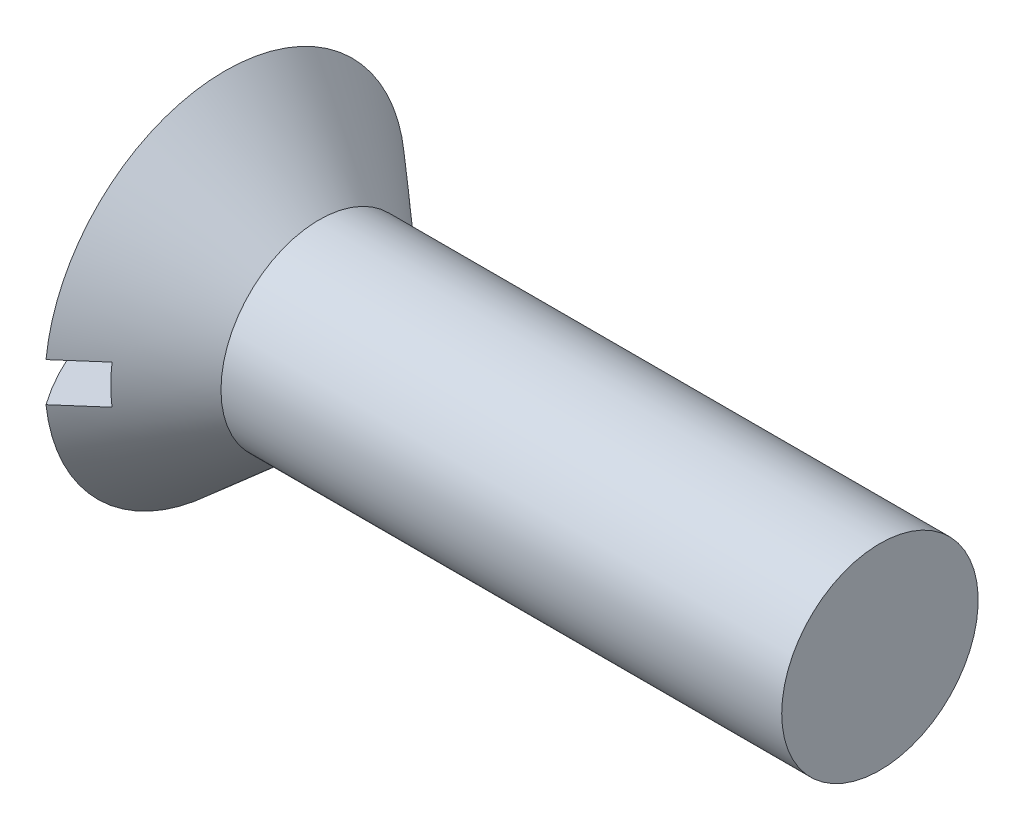
ISO-10303-21;
HEADER;
FILE_DESCRIPTION(('STEP AP214'),'2;1');
FILE_NAME('part.step','',(''),(''),'','','');
FILE_SCHEMA(('AUTOMOTIVE_DESIGN { 1 0 10303 214 1 1 1 1 }'));
ENDSEC;
DATA;
#1=APPLICATION_CONTEXT('core data for automotive mechanical design processes');
#2=APPLICATION_PROTOCOL_DEFINITION('international standard','automotive_design',2000,#1);
#3=PRODUCT_CONTEXT('',#1,'mechanical');
#4=PRODUCT('Part','Part','',(#3));
#5=PRODUCT_RELATED_PRODUCT_CATEGORY('part','',(#4));
#6=PRODUCT_DEFINITION_FORMATION('','',#4);
#7=PRODUCT_DEFINITION_CONTEXT('part definition',#1,'design');
#8=PRODUCT_DEFINITION('design','',#6,#7);
#9=PRODUCT_DEFINITION_SHAPE('','',#8);
#10=(LENGTH_UNIT() NAMED_UNIT(*) SI_UNIT(.MILLI.,.METRE.));
#11=(NAMED_UNIT(*) PLANE_ANGLE_UNIT() SI_UNIT($,.RADIAN.));
#12=(NAMED_UNIT(*) SI_UNIT($,.STERADIAN.) SOLID_ANGLE_UNIT());
#13=UNCERTAINTY_MEASURE_WITH_UNIT(LENGTH_MEASURE(1.E-05),#10,'distance_accuracy_value','');
#14=(GEOMETRIC_REPRESENTATION_CONTEXT(3) GLOBAL_UNCERTAINTY_ASSIGNED_CONTEXT((#13)) GLOBAL_UNIT_ASSIGNED_CONTEXT((#10,
#11,#12)) REPRESENTATION_CONTEXT('',''));
#15=CARTESIAN_POINT('',(0.,0.,0.));
#16=DIRECTION('',(0.,0.,1.));
#17=DIRECTION('',(1.,0.,0.));
#18=AXIS2_PLACEMENT_3D('',#15,#16,#17);
#19=CARTESIAN_POINT('',(8.9662,1.8923,-17.4625));
#20=DIRECTION('',(-1.,0.,0.));
#21=DIRECTION('',(0.,0.,1.));
#22=AXIS2_PLACEMENT_3D('',#19,#20,#21);
#23=PLANE('',#22);
#24=DIRECTION('',(0.,0.,1.));
#25=VECTOR('',#24,1.);
#26=CARTESIAN_POINT('',(8.9662,-1.8923,-17.4625));
#27=LINE('',#26,#25);
#28=CARTESIAN_POINT('',(8.9662,-1.8923,-14.3689069720272));
#29=VERTEX_POINT('',#28);
#30=CARTESIAN_POINT('',(8.9662,-1.8923,14.3689069720272));
#31=VERTEX_POINT('',#30);
#32=EDGE_CURVE('E244',#29,#31,#27,.T.);
#33=ORIENTED_EDGE('',*,*,#32,.T.);
#34=CARTESIAN_POINT('',(8.9662,0.,0.));
#35=DIRECTION('',(-1.,0.,0.));
#36=DIRECTION('',(0.,0.,1.));
#37=AXIS2_PLACEMENT_3D('',#34,#35,#36);
#38=CIRCLE('',#37,14.4929737066197);
#39=CARTESIAN_POINT('',(8.9662,1.8923,14.3689069720272));
#40=VERTEX_POINT('',#39);
#41=EDGE_CURVE('E264',#40,#31,#38,.F.);
#42=ORIENTED_EDGE('',*,*,#41,.F.);
#43=DIRECTION('',(0.,0.,-1.));
#44=VECTOR('',#43,1.);
#45=CARTESIAN_POINT('',(8.9662,1.8923,17.4625));
#46=LINE('',#45,#44);
#47=CARTESIAN_POINT('',(8.9662,1.8923,-14.3689069720272));
#48=VERTEX_POINT('',#47);
#49=EDGE_CURVE('E241',#40,#48,#46,.T.);
#50=ORIENTED_EDGE('',*,*,#49,.T.);
#51=EDGE_CURVE('E268',#29,#48,#38,.F.);
#52=ORIENTED_EDGE('',*,*,#51,.F.);
#53=EDGE_LOOP('',(#33,#42,#50,#52));
#54=FACE_BOUND('',#53,.T.);
#55=DIRECTION('',(0.,-1.,0.));
#56=VECTOR('',#55,1.);
#57=CARTESIAN_POINT('',(8.9662,1.8923,0.737997000000001));
#58=LINE('',#57,#56);
#59=CARTESIAN_POINT('',(8.9662,1.561719,0.737997));
#60=VERTEX_POINT('',#59);
#61=CARTESIAN_POINT('',(8.9662,0.737996999999997,0.737997));
#62=VERTEX_POINT('',#61);
#63=EDGE_CURVE('E183',#60,#62,#58,.T.);
#64=ORIENTED_EDGE('',*,*,#63,.T.);
#65=DIRECTION('',(0.,0.,1.));
#66=VECTOR('',#65,1.);
#67=CARTESIAN_POINT('',(8.9662,0.737997000000061,-17.4625));
#68=LINE('',#67,#66);
#69=CARTESIAN_POINT('',(8.9662,0.737996999999994,1.561719));
#70=VERTEX_POINT('',#69);
#71=EDGE_CURVE('E163',#62,#70,#68,.T.);
#72=ORIENTED_EDGE('',*,*,#71,.T.);
#73=DIRECTION('',(0.,1.,0.));
#74=VECTOR('',#73,1.);
#75=CARTESIAN_POINT('',(8.9662,1.89229999999993,1.56171900000001));
#76=LINE('',#75,#74);
#77=CARTESIAN_POINT('',(8.9662,-0.737997000000006,1.561719));
#78=VERTEX_POINT('',#77);
#79=EDGE_CURVE('E176',#78,#70,#76,.T.);
#80=ORIENTED_EDGE('',*,*,#79,.F.);
#81=DIRECTION('',(0.,0.,-1.));
#82=VECTOR('',#81,1.);
#83=CARTESIAN_POINT('',(8.9662,-0.737996999999937,-17.4625));
#84=LINE('',#83,#82);
#85=CARTESIAN_POINT('',(8.9662,-0.737997000000003,0.737997));
#86=VERTEX_POINT('',#85);
#87=EDGE_CURVE('E206',#78,#86,#84,.T.);
#88=ORIENTED_EDGE('',*,*,#87,.T.);
#89=CARTESIAN_POINT('',(8.9662,-1.561719,0.737997));
#90=VERTEX_POINT('',#89);
#91=EDGE_CURVE('E321',#86,#90,#58,.T.);
#92=ORIENTED_EDGE('',*,*,#91,.T.);
#93=DIRECTION('',(0.,0.,1.));
#94=VECTOR('',#93,1.);
#95=CARTESIAN_POINT('',(8.9662,-1.561719,-17.4625));
#96=LINE('',#95,#94);
#97=CARTESIAN_POINT('',(8.9662,-1.561719,-0.737997));
#98=VERTEX_POINT('',#97);
#99=EDGE_CURVE('E325',#98,#90,#96,.T.);
#100=ORIENTED_EDGE('',*,*,#99,.F.);
#101=DIRECTION('',(0.,1.,0.));
#102=VECTOR('',#101,1.);
#103=CARTESIAN_POINT('',(8.9662,1.8923,-0.737996999999997));
#104=LINE('',#103,#102);
#105=CARTESIAN_POINT('',(8.9662,-0.737996999999997,-0.737997));
#106=VERTEX_POINT('',#105);
#107=EDGE_CURVE('E323',#98,#106,#104,.T.);
#108=ORIENTED_EDGE('',*,*,#107,.T.);
#109=CARTESIAN_POINT('',(8.9662,-0.737996999999995,-1.561719));
#110=VERTEX_POINT('',#109);
#111=EDGE_CURVE('E352',#106,#110,#84,.T.);
#112=ORIENTED_EDGE('',*,*,#111,.T.);
#113=DIRECTION('',(0.,-1.,0.));
#114=VECTOR('',#113,1.);
#115=CARTESIAN_POINT('',(8.9662,1.89229999999994,-1.561719));
#116=LINE('',#115,#114);
#117=CARTESIAN_POINT('',(8.9662,0.737997000000005,-1.561719));
#118=VERTEX_POINT('',#117);
#119=EDGE_CURVE('E177',#118,#110,#116,.T.);
#120=ORIENTED_EDGE('',*,*,#119,.F.);
#121=CARTESIAN_POINT('',(8.9662,0.737997000000002,-0.737997));
#122=VERTEX_POINT('',#121);
#123=EDGE_CURVE('E167',#118,#122,#68,.T.);
#124=ORIENTED_EDGE('',*,*,#123,.T.);
#125=CARTESIAN_POINT('',(8.9662,1.561719,-0.737996999999998));
#126=VERTEX_POINT('',#125);
#127=EDGE_CURVE('E320',#122,#126,#104,.T.);
#128=ORIENTED_EDGE('',*,*,#127,.T.);
#129=DIRECTION('',(0.,0.,-1.));
#130=VECTOR('',#129,1.);
#131=CARTESIAN_POINT('',(8.9662,1.561719,-17.4625));
#132=LINE('',#131,#130);
#133=EDGE_CURVE('E41',#60,#126,#132,.T.);
#134=ORIENTED_EDGE('',*,*,#133,.F.);
#135=EDGE_LOOP('',(#64,#72,#80,#88,#92,#100,#108,#112,#120,#124,#128,#134));
#136=FACE_BOUND('',#135,.T.);
#137=ADVANCED_FACE('F33',(#54,#136),#23,.T.);
#138=CARTESIAN_POINT('',(11.034701986755,0.,0.603544370860927));
#139=DIRECTION('',(-0.06486312108268,0.,-0.997894170502771));
#140=DIRECTION('',(-0.997894170502771,0.,0.06486312108268));
#141=AXIS2_PLACEMENT_3D('',#138,#139,#140);
#142=PLANE('',#141);
#143=DIRECTION('',(0.797008859500097,-0.601741688922573,-0.0518055758675063));
#144=VECTOR('',#143,1.);
#145=CARTESIAN_POINT('',(0.,8.3312,1.3208));
#146=LINE('',#145,#144);
#147=CARTESIAN_POINT('',(10.16,0.660399999999998,0.660400000000001));
#148=VERTEX_POINT('',#147);
#149=EDGE_CURVE('E181',#60,#148,#146,.T.);
#150=ORIENTED_EDGE('',*,*,#149,.T.);
#151=DIRECTION('',(-0.995801588773824,0.0647271032702983,0.0647271032702984));
#152=VECTOR('',#151,1.);
#153=CARTESIAN_POINT('',(11.0736036517914,0.601015762633559,0.601015762633561));
#154=LINE('',#153,#152);
#155=EDGE_CURVE('E158',#148,#62,#154,.T.);
#156=ORIENTED_EDGE('',*,*,#155,.T.);
#157=ORIENTED_EDGE('',*,*,#63,.F.);
#158=EDGE_LOOP('',(#150,#156,#157));
#159=FACE_BOUND('',#158,.T.);
#160=ADVANCED_FACE('F182',(#159),#142,.T.);
#161=ORIENTED_EDGE('',*,*,#91,.F.);
#162=DIRECTION('',(0.995801588773824,0.0647271032702987,-0.0647271032702984));
#163=VECTOR('',#162,1.);
#164=CARTESIAN_POINT('',(11.0736036517914,-0.601015762633563,0.601015762633561));
#165=LINE('',#164,#163);
#166=CARTESIAN_POINT('',(10.16,-0.6604,0.6604));
#167=VERTEX_POINT('',#166);
#168=EDGE_CURVE('E335',#86,#167,#165,.T.);
#169=ORIENTED_EDGE('',*,*,#168,.T.);
#170=DIRECTION('',(0.797008859500097,0.601741688922573,-0.0518055758675061));
#171=VECTOR('',#170,1.);
#172=CARTESIAN_POINT('',(0.,-8.3312,1.3208));
#173=LINE('',#172,#171);
#174=EDGE_CURVE('E341',#90,#167,#173,.T.);
#175=ORIENTED_EDGE('',*,*,#174,.F.);
#176=EDGE_LOOP('',(#161,#169,#175));
#177=FACE_BOUND('',#176,.T.);
#178=ADVANCED_FACE('F315',(#177),#142,.T.);
#179=CARTESIAN_POINT('',(11.034701986755,0.,-0.603544370860927));
#180=DIRECTION('',(-0.0648631210826801,0.,0.997894170502771));
#181=DIRECTION('',(0.997894170502771,0.,0.0648631210826801));
#182=AXIS2_PLACEMENT_3D('',#179,#180,#181);
#183=PLANE('',#182);
#184=ORIENTED_EDGE('',*,*,#127,.F.);
#185=DIRECTION('',(0.995801588773824,-0.0647271032702988,0.0647271032702986));
#186=VECTOR('',#185,1.);
#187=CARTESIAN_POINT('',(11.0736036517914,0.601015762633563,-0.601015762633561));
#188=LINE('',#187,#186);
#189=CARTESIAN_POINT('',(10.16,0.660400000000002,-0.660399999999998));
#190=VERTEX_POINT('',#189);
#191=EDGE_CURVE('E331',#122,#190,#188,.T.);
#192=ORIENTED_EDGE('',*,*,#191,.T.);
#193=DIRECTION('',(0.797008859500097,-0.601741688922573,0.0518055758675063));
#194=VECTOR('',#193,1.);
#195=CARTESIAN_POINT('',(0.,8.3312,-1.3208));
#196=LINE('',#195,#194);
#197=EDGE_CURVE('E202',#126,#190,#196,.T.);
#198=ORIENTED_EDGE('',*,*,#197,.F.);
#199=EDGE_LOOP('',(#184,#192,#198));
#200=FACE_BOUND('',#199,.T.);
#201=ADVANCED_FACE('F330',(#200),#183,.T.);
#202=DIRECTION('',(0.797008859500097,0.601741688922573,0.0518055758675063));
#203=VECTOR('',#202,1.);
#204=CARTESIAN_POINT('',(0.,-8.3312,-1.3208));
#205=LINE('',#204,#203);
#206=CARTESIAN_POINT('',(10.16,-0.6604,-0.6604));
#207=VERTEX_POINT('',#206);
#208=EDGE_CURVE('E338',#98,#207,#205,.T.);
#209=ORIENTED_EDGE('',*,*,#208,.T.);
#210=DIRECTION('',(-0.995801588773824,-0.0647271032702982,-0.0647271032702986));
#211=VECTOR('',#210,1.);
#212=CARTESIAN_POINT('',(11.0736036517914,-0.601015762633559,-0.601015762633561));
#213=LINE('',#212,#211);
#214=EDGE_CURVE('E11',#207,#106,#213,.T.);
#215=ORIENTED_EDGE('',*,*,#214,.T.);
#216=ORIENTED_EDGE('',*,*,#107,.F.);
#217=EDGE_LOOP('',(#209,#215,#216));
#218=FACE_BOUND('',#217,.T.);
#219=ADVANCED_FACE('F398',(#218),#183,.T.);
#220=CARTESIAN_POINT('',(30.2463026544196,0.,0.));
#221=DIRECTION('',(-1.,0.,0.));
#222=DIRECTION('',(0.,1.,0.));
#223=AXIS2_PLACEMENT_3D('',#220,#221,#222);
#224=SPHERICAL_SURFACE('',#223,30.2463026544196);
#225=CARTESIAN_POINT('',(30.2463026544196,1.8923,0.));
#226=DIRECTION('',(0.,1.,0.));
#227=DIRECTION('',(0.,0.,1.));
#228=AXIS2_PLACEMENT_3D('',#225,#226,#227);
#229=CIRCLE('',#228,30.1870506173219);
#230=CARTESIAN_POINT('',(0.0879112121177569,1.8923,-1.31508577121235));
#231=VERTEX_POINT('',#230);
#232=CARTESIAN_POINT('',(5.55015076768326,1.8923,-17.3596689761067));
#233=VERTEX_POINT('',#232);
#234=EDGE_CURVE('E250',#231,#233,#229,.F.);
#235=ORIENTED_EDGE('',*,*,#234,.F.);
#236=CARTESIAN_POINT('',(30.20454047093,0.,0.642495130610448));
#237=DIRECTION('',(-0.0648631210826801,0.,0.997894170502771));
#238=DIRECTION('',(0.997894170502771,0.,0.0648631210826801));
#239=AXIS2_PLACEMENT_3D('',#236,#237,#238);
#240=CIRCLE('',#239,30.2394490721958);
#241=CARTESIAN_POINT('',(0.992628962046216,7.58176513365511,-1.256279117467));
#242=VERTEX_POINT('',#241);
#243=EDGE_CURVE('E233',#231,#242,#240,.F.);
#244=ORIENTED_EDGE('',*,*,#243,.T.);
#245=CARTESIAN_POINT('',(23.2711954614861,-9.23855257342197,0.));
#246=DIRECTION('',(0.602550800413168,0.798080530348567,0.));
#247=DIRECTION('',(-0.798080530348567,0.602550800413168,0.));
#248=AXIS2_PLACEMENT_3D('',#245,#246,#247);
#249=CIRCLE('',#248,27.9434402008406);
#250=CARTESIAN_POINT('',(0.992628962046216,7.58176513365511,1.256279117467));
#251=VERTEX_POINT('',#250);
#252=EDGE_CURVE('E239',#251,#242,#249,.F.);
#253=ORIENTED_EDGE('',*,*,#252,.F.);
#254=CARTESIAN_POINT('',(30.20454047093,0.,-0.642495130610445));
#255=DIRECTION('',(-0.06486312108268,0.,-0.997894170502771));
#256=DIRECTION('',(-0.997894170502771,0.,0.06486312108268));
#257=AXIS2_PLACEMENT_3D('',#254,#255,#256);
#258=CIRCLE('',#257,30.2394490721958);
#259=CARTESIAN_POINT('',(0.0879112121177569,1.8923,1.31508577121234));
#260=VERTEX_POINT('',#259);
#261=EDGE_CURVE('E223',#251,#260,#258,.F.);
#262=ORIENTED_EDGE('',*,*,#261,.T.);
#263=CARTESIAN_POINT('',(5.55015076768326,1.8923,17.3596689761067));
#264=VERTEX_POINT('',#263);
#265=EDGE_CURVE('E251',#264,#260,#229,.F.);
#266=ORIENTED_EDGE('',*,*,#265,.F.);
#267=CARTESIAN_POINT('',(5.55015076768326,0.,0.));
#268=DIRECTION('',(-1.,0.,0.));
#269=DIRECTION('',(0.,0.,1.));
#270=AXIS2_PLACEMENT_3D('',#267,#268,#269);
#271=CIRCLE('',#270,17.4625);
#272=EDGE_CURVE('E263',#264,#233,#271,.T.);
#273=ORIENTED_EDGE('',*,*,#272,.T.);
#274=EDGE_LOOP('',(#235,#244,#253,#262,#266,#273));
#275=FACE_BOUND('',#274,.T.);
#276=ADVANCED_FACE('F389',(#275),#224,.T.);
#277=CARTESIAN_POINT('',(23.2711954614861,9.23855257342197,0.));
#278=DIRECTION('',(0.602550800413168,-0.798080530348567,0.));
#279=DIRECTION('',(0.798080530348567,0.602550800413168,0.));
#280=AXIS2_PLACEMENT_3D('',#277,#278,#279);
#281=CIRCLE('',#280,27.9434402008406);
#282=CARTESIAN_POINT('',(0.992628962046223,-7.58176513365511,-1.256279117467));
#283=VERTEX_POINT('',#282);
#284=CARTESIAN_POINT('',(0.992628962046223,-7.58176513365511,1.25627911746699));
#285=VERTEX_POINT('',#284);
#286=EDGE_CURVE('E213',#283,#285,#281,.F.);
#287=ORIENTED_EDGE('',*,*,#286,.F.);
#288=CARTESIAN_POINT('',(30.20454047093,0.,0.642495130610448));
#289=DIRECTION('',(-0.0648631210826801,0.,0.997894170502771));
#290=DIRECTION('',(0.997894170502771,0.,0.0648631210826801));
#291=AXIS2_PLACEMENT_3D('',#288,#289,#290);
#292=CIRCLE('',#291,30.2394490721958);
#293=CARTESIAN_POINT('',(0.0879112121177569,-1.8923,-1.31508577121234));
#294=VERTEX_POINT('',#293);
#295=EDGE_CURVE('E228',#283,#294,#292,.F.);
#296=ORIENTED_EDGE('',*,*,#295,.T.);
#297=CARTESIAN_POINT('',(30.2463026544196,-1.8923,0.));
#298=DIRECTION('',(0.,-1.,0.));
#299=DIRECTION('',(0.,0.,-1.));
#300=AXIS2_PLACEMENT_3D('',#297,#298,#299);
#301=CIRCLE('',#300,30.1870506173219);
#302=CARTESIAN_POINT('',(5.55015076768326,-1.8923,-17.3596689761067));
#303=VERTEX_POINT('',#302);
#304=EDGE_CURVE('E247',#303,#294,#301,.F.);
#305=ORIENTED_EDGE('',*,*,#304,.F.);
#306=CARTESIAN_POINT('',(5.55015076768326,-1.8923,17.3596689761067));
#307=VERTEX_POINT('',#306);
#308=EDGE_CURVE('E260',#303,#307,#271,.T.);
#309=ORIENTED_EDGE('',*,*,#308,.T.);
#310=CARTESIAN_POINT('',(0.0879112121177569,-1.8923,1.31508577121234));
#311=VERTEX_POINT('',#310);
#312=EDGE_CURVE('E246',#311,#307,#301,.F.);
#313=ORIENTED_EDGE('',*,*,#312,.F.);
#314=CARTESIAN_POINT('',(30.20454047093,0.,-0.642495130610445));
#315=DIRECTION('',(-0.06486312108268,0.,-0.997894170502771));
#316=DIRECTION('',(-0.997894170502771,0.,0.06486312108268));
#317=AXIS2_PLACEMENT_3D('',#314,#315,#316);
#318=CIRCLE('',#317,30.2394490721958);
#319=EDGE_CURVE('E218',#311,#285,#318,.F.);
#320=ORIENTED_EDGE('',*,*,#319,.T.);
#321=EDGE_LOOP('',(#287,#296,#305,#309,#313,#320));
#322=FACE_BOUND('',#321,.T.);
#323=ADVANCED_FACE('F297',(#322),#224,.T.);
#324=CARTESIAN_POINT('',(8.9662,1.8923,17.4625));
#325=DIRECTION('',(0.,1.,0.));
#326=DIRECTION('',(0.,0.,1.));
#327=AXIS2_PLACEMENT_3D('',#324,#325,#326);
#328=PLANE('',#327);
#329=DIRECTION('',(0.997894170502771,0.,0.0648631210826801));
#330=VECTOR('',#329,1.);
#331=CARTESIAN_POINT('',(10.1442550225298,1.8923,-0.661423423535562));
#332=LINE('',#331,#330);
#333=CARTESIAN_POINT('',(8.52834437086092,1.8923,-0.76645761589404));
#334=VERTEX_POINT('',#333);
#335=EDGE_CURVE('E231',#231,#334,#332,.T.);
#336=ORIENTED_EDGE('',*,*,#335,.F.);
#337=ORIENTED_EDGE('',*,*,#234,.T.);
#338=CARTESIAN_POINT('',(-15.5050487870244,1.8923,-35.715411256053));
#339=CARTESIAN_POINT('',(-14.1406938946662,1.8923,-34.5277204460875));
#340=CARTESIAN_POINT('',(-12.7764101692872,1.8923,-33.3399478503759));
#341=CARTESIAN_POINT('',(-10.0480662383589,1.8923,-30.9641371574832));
#342=CARTESIAN_POINT('',(-8.68400603353929,1.8923,-29.7760990594641));
#343=CARTESIAN_POINT('',(-5.95598275077701,1.8923,-27.3994745834385));
#344=CARTESIAN_POINT('',(-4.59201972255149,1.8923,-26.2108881483583));
#345=CARTESIAN_POINT('',(-1.86456729081198,1.8923,-23.8331804116042));
#346=CARTESIAN_POINT('',(-0.501077885857071,1.8923,-22.6440591115832));
#347=CARTESIAN_POINT('',(2.21114624975865,1.8923,-20.2772147926854));
#348=CARTESIAN_POINT('',(3.55988847007737,1.8923,-19.0995003592516));
#349=CARTESIAN_POINT('',(5.58207778400165,1.8923,-17.3318587187282));
#350=CARTESIAN_POINT('',(6.25599005567694,1.8923,-16.742463730145));
#351=CARTESIAN_POINT('',(7.60338463053417,1.8923,-15.5631834328257));
#352=CARTESIAN_POINT('',(8.27686693403323,1.8923,-14.9732981244521));
#353=CARTESIAN_POINT('',(9.62314657913839,1.8923,-13.7929118092452));
#354=CARTESIAN_POINT('',(10.2959439943197,1.8923,-13.2024108863566));
#355=CARTESIAN_POINT('',(11.6406484749395,1.8923,-12.0203920037073));
#356=CARTESIAN_POINT('',(12.3125555377538,1.8923,-11.4288740409608));
#357=CARTESIAN_POINT('',(13.6549790344335,1.8923,-10.2442823919221));
#358=CARTESIAN_POINT('',(14.3254954909805,1.8923,-9.65120873136733));
#359=CARTESIAN_POINT('',(15.329486366636,1.8923,-8.75959235814434));
#360=CARTESIAN_POINT('',(15.6638518887317,1.8923,-8.46205330429902));
#361=CARTESIAN_POINT('',(16.3317648467099,1.8923,-7.86605866444231));
#362=CARTESIAN_POINT('',(16.6653122839489,1.8923,-7.5676030799524));
#363=CARTESIAN_POINT('',(17.1729591733058,1.8923,-7.11159936788207));
#364=CARTESIAN_POINT('',(17.3474765498339,1.8923,-6.95451652386059));
#365=CARTESIAN_POINT('',(17.6961222171558,1.8923,-6.63991888397761));
#366=CARTESIAN_POINT('',(17.8702505072904,1.8923,-6.4824040873852));
#367=CARTESIAN_POINT('',(18.2180548092783,1.8923,-6.16681999041022));
#368=CARTESIAN_POINT('',(18.3917307444353,1.8923,-6.00875060546426));
#369=CARTESIAN_POINT('',(18.7384791487361,1.8923,-5.69195182906337));
#370=CARTESIAN_POINT('',(18.911551619417,1.8923,-5.5332224392919));
#371=CARTESIAN_POINT('',(19.2574412821043,1.8923,-5.21445042438698));
#372=CARTESIAN_POINT('',(19.4302561657593,1.8923,-5.05440529236254));
#373=CARTESIAN_POINT('',(19.7748686897049,1.8923,-4.73322398482003));
#374=CARTESIAN_POINT('',(19.9466663344693,1.8923,-4.57208781410693));
#375=CARTESIAN_POINT('',(20.2888297919146,1.8923,-4.24842870066872));
#376=CARTESIAN_POINT('',(20.4591961226745,1.8923,-4.08590630678229));
#377=CARTESIAN_POINT('',(20.7980187364821,1.8923,-3.75888936456659));
#378=CARTESIAN_POINT('',(20.966475075445,1.8923,-3.59439487426204));
#379=CARTESIAN_POINT('',(21.3001804884037,1.8923,-3.26307453246861));
#380=CARTESIAN_POINT('',(21.4654370995266,1.8923,-3.09625632358994));
#381=CARTESIAN_POINT('',(21.7102247661526,1.8923,-2.84286427107941));
#382=CARTESIAN_POINT('',(21.7913457607458,1.8923,-2.75782782092495));
#383=CARTESIAN_POINT('',(21.9522191779615,1.8923,-2.58647210146903));
#384=CARTESIAN_POINT('',(22.0319716483269,1.8923,-2.50015287711572));
#385=CARTESIAN_POINT('',(22.1896478718393,1.8923,-2.32596801987568));
#386=CARTESIAN_POINT('',(22.2675729001441,1.8923,-2.23810354498035));
#387=CARTESIAN_POINT('',(22.4210573707777,1.8923,-2.06033879031684));
#388=CARTESIAN_POINT('',(22.4966170857272,1.8923,-1.97043874723722));
#389=CARTESIAN_POINT('',(22.6443921452942,1.8923,-1.78813953704011));
#390=CARTESIAN_POINT('',(22.716612334259,1.8923,-1.69574431893089));
#391=CARTESIAN_POINT('',(22.8564713797485,1.8923,-1.50756971452023));
#392=CARTESIAN_POINT('',(22.9241125101989,1.8923,-1.41179204441523));
#393=CARTESIAN_POINT('',(23.0326352711292,1.8923,-1.24636364508753));
#394=CARTESIAN_POINT('',(23.0752840952858,1.8923,-1.17787883755085));
#395=CARTESIAN_POINT('',(23.1563723088578,1.8923,-1.03839313004532));
#396=CARTESIAN_POINT('',(23.1948100305711,1.8923,-0.967391247879365));
#397=CARTESIAN_POINT('',(23.265817394353,1.8923,-0.823020781090298));
#398=CARTESIAN_POINT('',(23.2984219621897,1.8923,-0.749669612116625));
#399=CARTESIAN_POINT('',(23.3562088344318,1.8923,-0.600098904999972));
#400=CARTESIAN_POINT('',(23.3813986618587,1.8923,-0.523882363260541));
#401=CARTESIAN_POINT('',(23.4146011471886,1.8923,-0.398188450294271));
#402=CARTESIAN_POINT('',(23.4255088045655,1.8923,-0.349472913528134));
#403=CARTESIAN_POINT('',(23.4432112997752,1.8923,-0.251306315655984));
#404=CARTESIAN_POINT('',(23.4500077395474,1.8923,-0.20185554873848));
#405=CARTESIAN_POINT('',(23.4591640006617,1.8923,-0.102571113334321));
#406=CARTESIAN_POINT('',(23.4615265779003,1.8923,-0.0527377020386962));
#407=CARTESIAN_POINT('',(23.4617021955583,1.8923,0.0469391082625922));
#408=CARTESIAN_POINT('',(23.4595150922628,1.8923,0.0967825075340263));
#409=CARTESIAN_POINT('',(23.4507174985693,1.8923,0.19591822838853));
#410=CARTESIAN_POINT('',(23.4441205276539,1.8923,0.245211767524832));
#411=CARTESIAN_POINT('',(23.4268294874845,1.8923,0.34307671781607));
#412=CARTESIAN_POINT('',(23.4161344871422,1.8923,0.391647962255713));
#413=CARTESIAN_POINT('',(23.3910724511789,1.8923,0.487901686267014));
#414=CARTESIAN_POINT('',(23.3766998995794,1.8923,0.535582714310673));
#415=CARTESIAN_POINT('',(23.3447813564257,1.8923,0.629857733750252));
#416=CARTESIAN_POINT('',(23.3272353080617,1.8923,0.676451705669581));
#417=CARTESIAN_POINT('',(23.2621196900703,1.8923,0.835171634965796));
#418=CARTESIAN_POINT('',(23.2078474903393,1.8923,0.944552373281269));
#419=CARTESIAN_POINT('',(23.0888989375445,1.8923,1.15753031637594));
#420=CARTESIAN_POINT('',(23.0242010451044,1.8923,1.26111493630595));
#421=CARTESIAN_POINT('',(22.8874797589035,1.8923,1.46451215565515));
#422=CARTESIAN_POINT('',(22.8154009189496,1.8923,1.56428709726487));
#423=CARTESIAN_POINT('',(22.7038424674512,1.8923,1.7112154942889));
#424=CARTESIAN_POINT('',(22.6661011272396,1.8923,1.75971424608377));
#425=CARTESIAN_POINT('',(22.5896404560943,1.8923,1.85593349991345));
#426=CARTESIAN_POINT('',(22.5509211608063,1.8923,1.90365403020977));
#427=CARTESIAN_POINT('',(22.4259654389635,1.8923,2.05498191031409));
#428=CARTESIAN_POINT('',(22.3381770172976,1.8923,2.15730689834368));
#429=CARTESIAN_POINT('',(22.1598499364562,1.8923,2.35953904542222));
#430=CARTESIAN_POINT('',(22.0693108503742,1.8923,2.45944582479441));
#431=CARTESIAN_POINT('',(21.8861840656737,1.8923,2.65744732074372));
#432=CARTESIAN_POINT('',(21.7935954113279,1.8923,2.75554115107181));
#433=CARTESIAN_POINT('',(21.6069036040473,1.8923,2.95027925196814));
#434=CARTESIAN_POINT('',(21.5128003942839,1.8923,3.04692346788038));
#435=CARTESIAN_POINT('',(21.2284203878261,1.8923,3.33549678884803));
#436=CARTESIAN_POINT('',(21.0364062764932,1.8923,3.52571194321915));
#437=CARTESIAN_POINT('',(20.649545423937,1.8923,3.90310850493036));
#438=CARTESIAN_POINT('',(20.4546995023072,1.8923,4.09029075815395));
#439=CARTESIAN_POINT('',(20.0636531358933,1.8923,4.46201377176756));
#440=CARTESIAN_POINT('',(19.8674587498619,1.8923,4.6465609145948));
#441=CARTESIAN_POINT('',(19.4736812064114,1.8923,5.01419280376899));
#442=CARTESIAN_POINT('',(19.2760979511593,1.8923,5.19727744511568));
#443=CARTESIAN_POINT('',(18.8801396018289,1.8923,5.56215012309067));
#444=CARTESIAN_POINT('',(18.6817656150152,1.8923,5.74393936238488));
#445=CARTESIAN_POINT('',(18.2842596879924,1.8923,6.10667685406681));
#446=CARTESIAN_POINT('',(18.085127766288,1.8923,6.28762512674984));
#447=CARTESIAN_POINT('',(17.4887094890853,1.8923,6.82782429632752));
#448=CARTESIAN_POINT('',(17.0905582609395,1.8923,7.18612000208662));
#449=CARTESIAN_POINT('',(16.2927935845316,1.8923,7.90108069470821));
#450=CARTESIAN_POINT('',(15.8931801292718,1.8923,8.25774567374831));
#451=CARTESIAN_POINT('',(15.0929489801811,1.8923,8.9699637675936));
#452=CARTESIAN_POINT('',(14.6923312654854,1.8923,9.32551685894724));
#453=CARTESIAN_POINT('',(13.8903884584504,1.8923,10.0358246051659));
#454=CARTESIAN_POINT('',(13.4890633655511,1.8923,10.3905792593985));
#455=CARTESIAN_POINT('',(12.2839668356316,1.8923,11.4542863722709));
#456=CARTESIAN_POINT('',(11.4794272967914,1.8923,12.1623684469585));
#457=CARTESIAN_POINT('',(9.86917220045333,1.8923,13.5771764994327));
#458=CARTESIAN_POINT('',(9.06345665487773,1.8923,14.2839024908013));
#459=CARTESIAN_POINT('',(7.45128183702958,1.8923,15.6964671559335));
#460=CARTESIAN_POINT('',(6.64482258276531,1.8923,16.4023058502524));
#461=CARTESIAN_POINT('',(5.03138583562088,1.8923,17.8133948672345));
#462=CARTESIAN_POINT('',(4.22440834136755,1.8923,18.5186451883273));
#463=CARTESIAN_POINT('',(1.80314585578407,1.8923,20.6335994270577));
#464=CARTESIAN_POINT('',(0.188323506797995,1.8923,22.0426881149471));
#465=CARTESIAN_POINT('',(-2.59955329535079,1.8923,24.4740157008292));
#466=CARTESIAN_POINT('',(-3.7724226345945,1.8923,25.496466946773));
#467=CARTESIAN_POINT('',(-6.11850104395821,1.8923,27.5410693220214));
#468=CARTESIAN_POINT('',(-7.29171012526203,1.8923,28.5632204384939));
#469=CARTESIAN_POINT('',(-9.63820701662878,1.8923,30.6071669591651));
#470=CARTESIAN_POINT('',(-10.8114948031607,1.8923,31.6289623903804));
#471=CARTESIAN_POINT('',(-13.1581861982501,1.8923,33.6723301734104));
#472=CARTESIAN_POINT('',(-14.331589800709,1.8923,34.6939025322287));
#473=CARTESIAN_POINT('',(-15.5050487870244,1.8923,35.715411256053));
#474=B_SPLINE_CURVE_WITH_KNOTS('',3,(#338,#339,#340,#341,#342,#343,#344,#345,#346,#347,#348,
#349,#350,#351,#352,#353,#354,#355,#356,#357,#358,#359,#360,#361,#362,#363,#364,#365,#366,#367,
#368,#369,#370,#371,#372,#373,#374,#375,#376,#377,#378,#379,#380,#381,#382,#383,#384,#385,#386,
#387,#388,#389,#390,#391,#392,#393,#394,#395,#396,#397,#398,#399,#400,#401,#402,#403,#404,#405,
#406,#407,#408,#409,#410,#411,#412,#413,#414,#415,#416,#417,#418,#419,#420,#421,#422,#423,#424,
#425,#426,#427,#428,#429,#430,#431,#432,#433,#434,#435,#436,#437,#438,#439,#440,#441,#442,#443,
#444,#445,#446,#447,#448,#449,#450,#451,#452,#453,#454,#455,#456,#457,#458,#459,#460,#461,#462,
#463,#464,#465,#466,#467,#468,#469,#470,#471,#472,#473),.UNSPECIFIED.,.F.,.F.,(4,2,2,2,2,2,2,2,
2,2,2,2,2,2,2,2,2,2,2,2,2,2,2,2,2,2,2,2,2,2,2,2,2,2,2,2,2,2,2,2,2,2,2,2,2,2,2,2,2,2,2,2,2,2,2,2,
2,2,2,2,2,2,2,2,2,2,2,4),(0.,5.42666231652933,10.8533420116564,16.2808823916127,
21.7084061118935,27.0800952640718,29.7659651239619,32.4518330005921,35.1373730258867,
37.822920948902,40.5084247189664,41.8511701487009,43.1939133506184,43.8983146819705,
44.6027172060125,45.3072322600296,46.0117455181389,46.718364060081,47.4249794920767,
48.1313270670321,48.8376539099786,49.5420411097435,49.8946010140239,50.2471485936714,
50.5994423750671,50.9516954012586,51.3034202963648,51.6549692264842,51.8968961029009,
52.138918444718,52.3794392954108,52.6197152649404,52.7693296804186,52.9188857609001,
53.0683488529884,53.2178166663726,53.3668283399353,53.5158738896231,53.665144317541,
53.8144174178602,54.1797126497825,54.5457724888064,54.9148180946113,55.0991711395593,
55.2835174746561,55.6879070241039,56.0923596591878,56.4970050407717,56.9016656408742,
57.7124459096636,58.5229960162479,59.3310374481806,60.1391363812272,60.946348273211,
61.7535405822704,63.3604242054873,64.9673155286418,66.5742405182579,68.1811667803937,
71.396436042114,74.6116729308856,77.8268339088663,81.0420034414608,87.4715158103785,
92.1394126714226,96.807486310502,101.475037171149,106.142410594069),.UNSPECIFIED.);
#475=EDGE_CURVE('E367',#233,#48,#474,.T.);
#476=ORIENTED_EDGE('',*,*,#475,.T.);
#477=ORIENTED_EDGE('',*,*,#49,.F.);
#478=EDGE_CURVE('E277',#40,#264,#474,.T.);
#479=ORIENTED_EDGE('',*,*,#478,.T.);
#480=ORIENTED_EDGE('',*,*,#265,.T.);
#481=DIRECTION('',(-0.997894170502771,0.,0.06486312108268));
#482=VECTOR('',#481,1.);
#483=CARTESIAN_POINT('',(7.88368094799472,1.8923,0.808360738380341));
#484=LINE('',#483,#482);
#485=CARTESIAN_POINT('',(8.52834437086092,1.8923,0.766457615894039));
#486=VERTEX_POINT('',#485);
#487=EDGE_CURVE('E221',#486,#260,#484,.T.);
#488=ORIENTED_EDGE('',*,*,#487,.F.);
#489=DIRECTION('',(0.,0.,-1.));
#490=VECTOR('',#489,1.);
#491=CARTESIAN_POINT('',(8.52834437086093,1.8923,17.4625));
#492=LINE('',#491,#490);
#493=EDGE_CURVE('E236',#486,#334,#492,.T.);
#494=ORIENTED_EDGE('',*,*,#493,.T.);
#495=EDGE_LOOP('',(#336,#337,#476,#477,#479,#480,#488,#494));
#496=FACE_BOUND('',#495,.T.);
#497=ADVANCED_FACE('F292',(#496),#328,.F.);
#498=CARTESIAN_POINT('',(8.9662,-1.8923,-17.4625));
#499=DIRECTION('',(0.,-1.,0.));
#500=DIRECTION('',(0.,0.,-1.));
#501=AXIS2_PLACEMENT_3D('',#498,#499,#500);
#502=PLANE('',#501);
#503=DIRECTION('',(-0.997894170502771,0.,-0.0648631210826801));
#504=VECTOR('',#503,1.);
#505=CARTESIAN_POINT('',(7.88368094799472,-1.8923,-0.808360738380341));
#506=LINE('',#505,#504);
#507=CARTESIAN_POINT('',(8.52834437086093,-1.8923,-0.766457615894042));
#508=VERTEX_POINT('',#507);
#509=EDGE_CURVE('E226',#508,#294,#506,.T.);
#510=ORIENTED_EDGE('',*,*,#509,.F.);
#511=DIRECTION('',(0.,0.,1.));
#512=VECTOR('',#511,1.);
#513=CARTESIAN_POINT('',(8.52834437086093,-1.8923,-17.4625));
#514=LINE('',#513,#512);
#515=CARTESIAN_POINT('',(8.52834437086093,-1.8923,0.766457615894035));
#516=VERTEX_POINT('',#515);
#517=EDGE_CURVE('E210',#508,#516,#514,.T.);
#518=ORIENTED_EDGE('',*,*,#517,.T.);
#519=DIRECTION('',(0.997894170502771,0.,-0.06486312108268));
#520=VECTOR('',#519,1.);
#521=CARTESIAN_POINT('',(10.1442550225298,-1.8923,0.661423423535562));
#522=LINE('',#521,#520);
#523=EDGE_CURVE('E216',#311,#516,#522,.T.);
#524=ORIENTED_EDGE('',*,*,#523,.F.);
#525=ORIENTED_EDGE('',*,*,#312,.T.);
#526=CARTESIAN_POINT('',(-15.5050487870244,-1.8923,35.715411256053));
#527=CARTESIAN_POINT('',(-14.1406938946662,-1.8923,34.5277204460875));
#528=CARTESIAN_POINT('',(-12.7764101692872,-1.8923,33.3399478503759));
#529=CARTESIAN_POINT('',(-10.0480662383589,-1.8923,30.9641371574832));
#530=CARTESIAN_POINT('',(-8.68400603353927,-1.8923,29.776099059464));
#531=CARTESIAN_POINT('',(-5.95598275077698,-1.8923,27.3994745834385));
#532=CARTESIAN_POINT('',(-4.59201972255145,-1.8923,26.2108881483583));
#533=CARTESIAN_POINT('',(-1.86456729081194,-1.8923,23.8331804116042));
#534=CARTESIAN_POINT('',(-0.501077885857034,-1.8923,22.6440591115832));
#535=CARTESIAN_POINT('',(2.21114624975868,-1.8923,20.2772147926854));
#536=CARTESIAN_POINT('',(3.5598884700774,-1.8923,19.0995003592515));
#537=CARTESIAN_POINT('',(5.58207778400167,-1.8923,17.3318587187282));
#538=CARTESIAN_POINT('',(6.25599005567696,-1.8923,16.742463730145));
#539=CARTESIAN_POINT('',(7.60338463053419,-1.8923,15.5631834328257));
#540=CARTESIAN_POINT('',(8.27686693403325,-1.8923,14.9732981244521));
#541=CARTESIAN_POINT('',(9.6231465791384,-1.8923,13.7929118092452));
#542=CARTESIAN_POINT('',(10.2959439943197,-1.8923,13.2024108863566));
#543=CARTESIAN_POINT('',(11.6406484749395,-1.8923,12.0203920037073));
#544=CARTESIAN_POINT('',(12.3125555377538,-1.8923,11.4288740409608));
#545=CARTESIAN_POINT('',(13.6549790344335,-1.8923,10.2442823919221));
#546=CARTESIAN_POINT('',(14.3254954909805,-1.8923,9.65120873136732));
#547=CARTESIAN_POINT('',(15.329486366636,-1.8923,8.75959235814434));
#548=CARTESIAN_POINT('',(15.6638518887317,-1.8923,8.46205330429901));
#549=CARTESIAN_POINT('',(16.33176484671,-1.8923,7.86605866444231));
#550=CARTESIAN_POINT('',(16.6653122839489,-1.8923,7.5676030799524));
#551=CARTESIAN_POINT('',(17.1729591733058,-1.8923,7.11159936788207));
#552=CARTESIAN_POINT('',(17.3474765498339,-1.8923,6.95451652386058));
#553=CARTESIAN_POINT('',(17.6961222171558,-1.8923,6.63991888397761));
#554=CARTESIAN_POINT('',(17.8702505072904,-1.8923,6.4824040873852));
#555=CARTESIAN_POINT('',(18.2180548092783,-1.8923,6.16681999041022));
#556=CARTESIAN_POINT('',(18.3917307444353,-1.8923,6.00875060546426));
#557=CARTESIAN_POINT('',(18.7384791487361,-1.8923,5.69195182906336));
#558=CARTESIAN_POINT('',(18.911551619417,-1.8923,5.5332224392919));
#559=CARTESIAN_POINT('',(19.2574412821043,-1.8923,5.21445042438698));
#560=CARTESIAN_POINT('',(19.4302561657593,-1.8923,5.05440529236253));
#561=CARTESIAN_POINT('',(19.7748686897049,-1.8923,4.73322398482002));
#562=CARTESIAN_POINT('',(19.9466663344693,-1.8923,4.57208781410692));
#563=CARTESIAN_POINT('',(20.2888297919146,-1.8923,4.24842870066872));
#564=CARTESIAN_POINT('',(20.4591961226745,-1.8923,4.08590630678228));
#565=CARTESIAN_POINT('',(20.7980187364821,-1.8923,3.75888936456659));
#566=CARTESIAN_POINT('',(20.966475075445,-1.8923,3.59439487426204));
#567=CARTESIAN_POINT('',(21.3001804884037,-1.8923,3.2630745324686));
#568=CARTESIAN_POINT('',(21.4654370995266,-1.8923,3.09625632358994));
#569=CARTESIAN_POINT('',(21.7102247661526,-1.8923,2.8428642710794));
#570=CARTESIAN_POINT('',(21.7913457607458,-1.8923,2.75782782092494));
#571=CARTESIAN_POINT('',(21.9522191779615,-1.8923,2.58647210146903));
#572=CARTESIAN_POINT('',(22.0319716483269,-1.8923,2.50015287711572));
#573=CARTESIAN_POINT('',(22.1896478718393,-1.8923,2.32596801987568));
#574=CARTESIAN_POINT('',(22.2675729001441,-1.8923,2.23810354498035));
#575=CARTESIAN_POINT('',(22.4210573707777,-1.8923,2.06033879031685));
#576=CARTESIAN_POINT('',(22.4966170857272,-1.8923,1.97043874723722));
#577=CARTESIAN_POINT('',(22.6443921452942,-1.8923,1.78813953704011));
#578=CARTESIAN_POINT('',(22.716612334259,-1.8923,1.69574431893089));
#579=CARTESIAN_POINT('',(22.8564713797485,-1.8923,1.50756971452023));
#580=CARTESIAN_POINT('',(22.9241125101989,-1.8923,1.41179204441522));
#581=CARTESIAN_POINT('',(23.0326352711292,-1.8923,1.24636364508752));
#582=CARTESIAN_POINT('',(23.0752840952858,-1.8923,1.17787883755085));
#583=CARTESIAN_POINT('',(23.1563723088578,-1.8923,1.03839313004532));
#584=CARTESIAN_POINT('',(23.1948100305711,-1.8923,0.967391247879358));
#585=CARTESIAN_POINT('',(23.265817394353,-1.8923,0.82302078109029));
#586=CARTESIAN_POINT('',(23.2984219621897,-1.8923,0.74966961211662));
#587=CARTESIAN_POINT('',(23.3562088344318,-1.8923,0.600098904999969));
#588=CARTESIAN_POINT('',(23.3813986618587,-1.8923,0.523882363260537));
#589=CARTESIAN_POINT('',(23.4146011471886,-1.8923,0.398188450294264));
#590=CARTESIAN_POINT('',(23.4255088045655,-1.8923,0.349472913528125));
#591=CARTESIAN_POINT('',(23.4432112997752,-1.8923,0.251306315655974));
#592=CARTESIAN_POINT('',(23.4500077395474,-1.8923,0.201855548738474));
#593=CARTESIAN_POINT('',(23.4591640006617,-1.8923,0.102571113334317));
#594=CARTESIAN_POINT('',(23.4615265779003,-1.8923,0.0527377020386924));
#595=CARTESIAN_POINT('',(23.4617021955583,-1.8923,-0.0469391082625961));
#596=CARTESIAN_POINT('',(23.4595150922628,-1.8923,-0.0967825075340303));
#597=CARTESIAN_POINT('',(23.4507174985693,-1.8923,-0.195918228388534));
#598=CARTESIAN_POINT('',(23.4441205276539,-1.8923,-0.245211767524834));
#599=CARTESIAN_POINT('',(23.4268294874845,-1.8923,-0.343076717816074));
#600=CARTESIAN_POINT('',(23.4161344871422,-1.8923,-0.391647962255719));
#601=CARTESIAN_POINT('',(23.3910724511789,-1.8923,-0.487901686267023));
#602=CARTESIAN_POINT('',(23.3766998995794,-1.8923,-0.535582714310681));
#603=CARTESIAN_POINT('',(23.3447813564257,-1.8923,-0.62985773375026));
#604=CARTESIAN_POINT('',(23.3272353080617,-1.8923,-0.676451705669586));
#605=CARTESIAN_POINT('',(23.2621196900702,-1.8923,-0.8351716349658));
#606=CARTESIAN_POINT('',(23.2078474903393,-1.8923,-0.944552373281275));
#607=CARTESIAN_POINT('',(23.0888989375445,-1.8923,-1.15753031637595));
#608=CARTESIAN_POINT('',(23.0242010451044,-1.8923,-1.26111493630596));
#609=CARTESIAN_POINT('',(22.8874797589035,-1.8923,-1.46451215565516));
#610=CARTESIAN_POINT('',(22.8154009189496,-1.8923,-1.56428709726488));
#611=CARTESIAN_POINT('',(22.7038424674512,-1.8923,-1.7112154942889));
#612=CARTESIAN_POINT('',(22.6661011272396,-1.8923,-1.75971424608377));
#613=CARTESIAN_POINT('',(22.5896404560943,-1.8923,-1.85593349991345));
#614=CARTESIAN_POINT('',(22.5509211608063,-1.8923,-1.90365403020978));
#615=CARTESIAN_POINT('',(22.4259654389635,-1.8923,-2.0549819103141));
#616=CARTESIAN_POINT('',(22.3381770172976,-1.8923,-2.15730689834369));
#617=CARTESIAN_POINT('',(22.1598499364562,-1.8923,-2.35953904542222));
#618=CARTESIAN_POINT('',(22.0693108503742,-1.8923,-2.45944582479442));
#619=CARTESIAN_POINT('',(21.8861840656736,-1.8923,-2.65744732074373));
#620=CARTESIAN_POINT('',(21.7935954113279,-1.8923,-2.75554115107182));
#621=CARTESIAN_POINT('',(21.6069036040473,-1.8923,-2.95027925196814));
#622=CARTESIAN_POINT('',(21.5128003942839,-1.8923,-3.04692346788038));
#623=CARTESIAN_POINT('',(21.2284203878261,-1.8923,-3.33549678884804));
#624=CARTESIAN_POINT('',(21.0364062764931,-1.8923,-3.52571194321916));
#625=CARTESIAN_POINT('',(20.649545423937,-1.8923,-3.90310850493037));
#626=CARTESIAN_POINT('',(20.4546995023072,-1.8923,-4.09029075815397));
#627=CARTESIAN_POINT('',(20.0636531358932,-1.8923,-4.46201377176758));
#628=CARTESIAN_POINT('',(19.8674587498619,-1.8923,-4.64656091459482));
#629=CARTESIAN_POINT('',(19.4736812064114,-1.8923,-5.01419280376901));
#630=CARTESIAN_POINT('',(19.2760979511593,-1.8923,-5.1972774451157));
#631=CARTESIAN_POINT('',(18.8801396018289,-1.8923,-5.56215012309069));
#632=CARTESIAN_POINT('',(18.6817656150152,-1.8923,-5.7439393623849));
#633=CARTESIAN_POINT('',(18.2842596879924,-1.8923,-6.10667685406683));
#634=CARTESIAN_POINT('',(18.0851277662879,-1.8923,-6.28762512674987));
#635=CARTESIAN_POINT('',(17.4887094890853,-1.8923,-6.82782429632754));
#636=CARTESIAN_POINT('',(17.0905582609395,-1.8923,-7.18612000208665));
#637=CARTESIAN_POINT('',(16.2927935845315,-1.8923,-7.90108069470824));
#638=CARTESIAN_POINT('',(15.8931801292717,-1.8923,-8.25774567374835));
#639=CARTESIAN_POINT('',(15.092948980181,-1.8923,-8.96996376759364));
#640=CARTESIAN_POINT('',(14.6923312654854,-1.8923,-9.32551685894728));
#641=CARTESIAN_POINT('',(13.8903884584504,-1.8923,-10.035824605166));
#642=CARTESIAN_POINT('',(13.4890633655511,-1.8923,-10.3905792593985));
#643=CARTESIAN_POINT('',(12.2839668356315,-1.8923,-11.454286372271));
#644=CARTESIAN_POINT('',(11.4794272967913,-1.8923,-12.1623684469586));
#645=CARTESIAN_POINT('',(9.86917220045325,-1.8923,-13.5771764994327));
#646=CARTESIAN_POINT('',(9.06345665487765,-1.8923,-14.2839024908014));
#647=CARTESIAN_POINT('',(7.45128183702949,-1.8923,-15.6964671559336));
#648=CARTESIAN_POINT('',(6.64482258276522,-1.8923,-16.4023058502525));
#649=CARTESIAN_POINT('',(5.03138583562079,-1.8923,-17.8133948672346));
#650=CARTESIAN_POINT('',(4.22440834136745,-1.8923,-18.5186451883274));
#651=CARTESIAN_POINT('',(1.80314585578395,-1.8923,-20.6335994270578));
#652=CARTESIAN_POINT('',(0.188323506797874,-1.8923,-22.0426881149472));
#653=CARTESIAN_POINT('',(-2.59955329535091,-1.89229999999999,-24.4740157008293));
#654=CARTESIAN_POINT('',(-3.77242263459462,-1.89229999999999,-25.4964669467731));
#655=CARTESIAN_POINT('',(-6.11850104395831,-1.89229999999999,-27.5410693220215));
#656=CARTESIAN_POINT('',(-7.29171012526212,-1.89229999999999,-28.563220438494));
#657=CARTESIAN_POINT('',(-9.63820701662884,-1.89229999999999,-30.6071669591651));
#658=CARTESIAN_POINT('',(-10.8114948031608,-1.89229999999999,-31.6289623903805));
#659=CARTESIAN_POINT('',(-13.1581861982501,-1.89229999999999,-33.6723301734104));
#660=CARTESIAN_POINT('',(-14.331589800709,-1.89229999999999,-34.6939025322287));
#661=CARTESIAN_POINT('',(-15.5050487870244,-1.89229999999999,-35.715411256053));
#662=B_SPLINE_CURVE_WITH_KNOTS('',3,(#526,#527,#528,#529,#530,#531,#532,#533,#534,#535,#536,
#537,#538,#539,#540,#541,#542,#543,#544,#545,#546,#547,#548,#549,#550,#551,#552,#553,#554,#555,
#556,#557,#558,#559,#560,#561,#562,#563,#564,#565,#566,#567,#568,#569,#570,#571,#572,#573,#574,
#575,#576,#577,#578,#579,#580,#581,#582,#583,#584,#585,#586,#587,#588,#589,#590,#591,#592,#593,
#594,#595,#596,#597,#598,#599,#600,#601,#602,#603,#604,#605,#606,#607,#608,#609,#610,#611,#612,
#613,#614,#615,#616,#617,#618,#619,#620,#621,#622,#623,#624,#625,#626,#627,#628,#629,#630,#631,
#632,#633,#634,#635,#636,#637,#638,#639,#640,#641,#642,#643,#644,#645,#646,#647,#648,#649,#650,
#651,#652,#653,#654,#655,#656,#657,#658,#659,#660,#661),.UNSPECIFIED.,.F.,.F.,(4,2,2,2,2,2,2,2,
2,2,2,2,2,2,2,2,2,2,2,2,2,2,2,2,2,2,2,2,2,2,2,2,2,2,2,2,2,2,2,2,2,2,2,2,2,2,2,2,2,2,2,2,2,2,2,2,
2,2,2,2,2,2,2,2,2,2,2,4),(0.,5.42666231652934,10.8533420116564,16.2808823916128,
21.7084061118935,27.0800952640718,29.7659651239619,32.4518330005921,35.1373730258867,
37.822920948902,40.5084247189664,41.8511701487009,43.1939133506184,43.8983146819705,
44.6027172060125,45.3072322600296,46.0117455181389,46.7183640600811,47.4249794920767,
48.1313270670321,48.8376539099787,49.5420411097435,49.8946010140239,50.2471485936714,
50.5994423750671,50.9516954012586,51.3034202963648,51.6549692264843,51.8968961029009,
52.138918444718,52.3794392954108,52.6197152649404,52.7693296804186,52.9188857609001,
53.0683488529884,53.2178166663726,53.3668283399353,53.5158738896231,53.665144317541,
53.8144174178602,54.1797126497825,54.5457724888064,54.9148180946113,55.0991711395593,
55.2835174746561,55.6879070241039,56.0923596591878,56.4970050407717,56.9016656408742,
57.7124459096636,58.5229960162479,59.3310374481806,60.1391363812273,60.946348273211,
61.7535405822704,63.3604242054874,64.9673155286418,66.574240518258,68.1811667803938,
71.3964360421141,74.6116729308857,77.8268339088664,81.0420034414609,87.4715158103786,
92.1394126714227,96.8074863105021,101.47503717115,106.142410594069),.UNSPECIFIED.);
#663=EDGE_CURVE('E267',#307,#31,#662,.T.);
#664=ORIENTED_EDGE('',*,*,#663,.T.);
#665=ORIENTED_EDGE('',*,*,#32,.F.);
#666=EDGE_CURVE('E278',#29,#303,#662,.T.);
#667=ORIENTED_EDGE('',*,*,#666,.T.);
#668=ORIENTED_EDGE('',*,*,#304,.T.);
#669=EDGE_LOOP('',(#510,#518,#524,#525,#664,#665,#667,#668));
#670=FACE_BOUND('',#669,.T.);
#671=ADVANCED_FACE('F288',(#670),#502,.F.);
#672=CARTESIAN_POINT('',(69.0501507676833,0.,0.));
#673=DIRECTION('',(-1.,0.,0.));
#674=DIRECTION('',(0.,0.,1.));
#675=AXIS2_PLACEMENT_3D('',#672,#673,#674);
#676=PLANE('',#675);
#677=CARTESIAN_POINT('',(69.0501507676833,0.,0.));
#678=DIRECTION('',(-1.,0.,0.));
#679=DIRECTION('',(0.,0.,1.));
#680=AXIS2_PLACEMENT_3D('',#677,#678,#679);
#681=CIRCLE('',#680,9.525);
#682=CARTESIAN_POINT('',(69.0501507676833,0.,9.525));
#683=VERTEX_POINT('',#682);
#684=EDGE_CURVE('E254',#683,#683,#681,.T.);
#685=ORIENTED_EDGE('',*,*,#684,.F.);
#686=EDGE_LOOP('',(#685));
#687=FACE_BOUND('',#686,.T.);
#688=ADVANCED_FACE('F35',(#687),#676,.F.);
#689=CARTESIAN_POINT('',(5.55015076768326,0.,0.));
#690=DIRECTION('',(-1.,0.,0.));
#691=DIRECTION('',(0.,0.,1.));
#692=AXIS2_PLACEMENT_3D('',#689,#690,#691);
#693=CONICAL_SURFACE('',#692,17.4625,0.715584993317677);
#694=ORIENTED_EDGE('',*,*,#475,.F.);
#695=ORIENTED_EDGE('',*,*,#272,.F.);
#696=ORIENTED_EDGE('',*,*,#478,.F.);
#697=ORIENTED_EDGE('',*,*,#41,.T.);
#698=ORIENTED_EDGE('',*,*,#663,.F.);
#699=ORIENTED_EDGE('',*,*,#308,.F.);
#700=ORIENTED_EDGE('',*,*,#666,.F.);
#701=ORIENTED_EDGE('',*,*,#51,.T.);
#702=EDGE_LOOP('',(#694,#695,#696,#697,#698,#699,#700,#701));
#703=FACE_BOUND('',#702,.T.);
#704=CARTESIAN_POINT('',(14.6812,0.,0.));
#705=DIRECTION('',(-1.,0.,0.));
#706=DIRECTION('',(0.,0.,1.));
#707=AXIS2_PLACEMENT_3D('',#704,#705,#706);
#708=CIRCLE('',#707,9.525);
#709=CARTESIAN_POINT('',(14.6812,0.,9.525));
#710=VERTEX_POINT('',#709);
#711=EDGE_CURVE('E257',#710,#710,#708,.T.);
#712=ORIENTED_EDGE('',*,*,#711,.T.);
#713=EDGE_LOOP('',(#712));
#714=FACE_BOUND('',#713,.T.);
#715=ADVANCED_FACE('F285',(#703,#714),#693,.T.);
#716=CARTESIAN_POINT('',(-15.875,0.,0.));
#717=DIRECTION('',(-1.,0.,0.));
#718=DIRECTION('',(0.,0.,1.));
#719=AXIS2_PLACEMENT_3D('',#716,#717,#718);
#720=CYLINDRICAL_SURFACE('',#719,9.525);
#721=ORIENTED_EDGE('',*,*,#711,.F.);
#722=EDGE_LOOP('',(#721));
#723=FACE_BOUND('',#722,.T.);
#724=ORIENTED_EDGE('',*,*,#684,.T.);
#725=EDGE_LOOP('',(#724));
#726=FACE_BOUND('',#725,.T.);
#727=ADVANCED_FACE('F299',(#723,#726),#720,.T.);
#728=CARTESIAN_POINT('',(10.16,0.6604,-0.6604));
#729=DIRECTION('',(-1.,0.,0.));
#730=DIRECTION('',(0.,0.,1.));
#731=AXIS2_PLACEMENT_3D('',#728,#729,#730);
#732=PLANE('',#731);
#733=DIRECTION('',(0.,1.,0.));
#734=VECTOR('',#733,1.);
#735=CARTESIAN_POINT('',(10.16,-0.6604,-0.6604));
#736=LINE('',#735,#734);
#737=EDGE_CURVE('E203',#207,#190,#736,.T.);
#738=ORIENTED_EDGE('',*,*,#737,.F.);
#739=DIRECTION('',(0.,0.,1.));
#740=VECTOR('',#739,1.);
#741=CARTESIAN_POINT('',(10.16,-0.6604,-0.6604));
#742=LINE('',#741,#740);
#743=EDGE_CURVE('E197',#207,#167,#742,.T.);
#744=ORIENTED_EDGE('',*,*,#743,.T.);
#745=DIRECTION('',(0.,-1.,0.));
#746=VECTOR('',#745,1.);
#747=CARTESIAN_POINT('',(10.16,0.6604,0.6604));
#748=LINE('',#747,#746);
#749=EDGE_CURVE('E173',#148,#167,#748,.T.);
#750=ORIENTED_EDGE('',*,*,#749,.F.);
#751=DIRECTION('',(0.,0.,-1.));
#752=VECTOR('',#751,1.);
#753=CARTESIAN_POINT('',(10.16,0.6604,0.6604));
#754=LINE('',#753,#752);
#755=EDGE_CURVE('E195',#148,#190,#754,.T.);
#756=ORIENTED_EDGE('',*,*,#755,.T.);
#757=EDGE_LOOP('',(#738,#744,#750,#756));
#758=FACE_BOUND('',#757,.T.);
#759=ADVANCED_FACE('F194',(#758),#732,.T.);
#760=CARTESIAN_POINT('',(10.16,-0.6604,-0.6604));
#761=DIRECTION('',(0.602550800413168,-0.798080530348567,0.));
#762=DIRECTION('',(0.798080530348567,0.602550800413168,0.));
#763=AXIS2_PLACEMENT_3D('',#760,#761,#762);
#764=PLANE('',#763);
#765=ORIENTED_EDGE('',*,*,#99,.T.);
#766=ORIENTED_EDGE('',*,*,#174,.T.);
#767=ORIENTED_EDGE('',*,*,#743,.F.);
#768=ORIENTED_EDGE('',*,*,#208,.F.);
#769=EDGE_LOOP('',(#765,#766,#767,#768));
#770=FACE_BOUND('',#769,.T.);
#771=ADVANCED_FACE('F306',(#770),#764,.F.);
#772=CARTESIAN_POINT('',(10.16,0.6604,0.6604));
#773=DIRECTION('',(0.602550800413168,0.798080530348567,0.));
#774=DIRECTION('',(-0.798080530348567,0.602550800413168,0.));
#775=AXIS2_PLACEMENT_3D('',#772,#773,#774);
#776=PLANE('',#775);
#777=ORIENTED_EDGE('',*,*,#133,.T.);
#778=ORIENTED_EDGE('',*,*,#197,.T.);
#779=ORIENTED_EDGE('',*,*,#755,.F.);
#780=ORIENTED_EDGE('',*,*,#149,.F.);
#781=EDGE_LOOP('',(#777,#778,#779,#780));
#782=FACE_BOUND('',#781,.T.);
#783=ADVANCED_FACE('F200',(#782),#776,.F.);
#784=ORIENTED_EDGE('',*,*,#286,.T.);
#785=EDGE_CURVE('E56',#285,#516,#173,.T.);
#786=ORIENTED_EDGE('',*,*,#785,.T.);
#787=ORIENTED_EDGE('',*,*,#517,.F.);
#788=EDGE_CURVE('E188',#283,#508,#205,.T.);
#789=ORIENTED_EDGE('',*,*,#788,.F.);
#790=EDGE_LOOP('',(#784,#786,#787,#789));
#791=FACE_BOUND('',#790,.T.);
#792=ADVANCED_FACE('F473',(#791),#764,.F.);
#793=ORIENTED_EDGE('',*,*,#523,.T.);
#794=ORIENTED_EDGE('',*,*,#785,.F.);
#795=ORIENTED_EDGE('',*,*,#319,.F.);
#796=EDGE_LOOP('',(#793,#794,#795));
#797=FACE_BOUND('',#796,.T.);
#798=ADVANCED_FACE('F317',(#797),#142,.T.);
#799=ORIENTED_EDGE('',*,*,#788,.T.);
#800=ORIENTED_EDGE('',*,*,#509,.T.);
#801=ORIENTED_EDGE('',*,*,#295,.F.);
#802=EDGE_LOOP('',(#799,#800,#801));
#803=FACE_BOUND('',#802,.T.);
#804=ADVANCED_FACE('F397',(#803),#183,.T.);
#805=ORIENTED_EDGE('',*,*,#252,.T.);
#806=EDGE_CURVE('E214',#242,#334,#196,.T.);
#807=ORIENTED_EDGE('',*,*,#806,.T.);
#808=ORIENTED_EDGE('',*,*,#493,.F.);
#809=EDGE_CURVE('E48',#251,#486,#146,.T.);
#810=ORIENTED_EDGE('',*,*,#809,.F.);
#811=EDGE_LOOP('',(#805,#807,#808,#810));
#812=FACE_BOUND('',#811,.T.);
#813=ADVANCED_FACE('F393',(#812),#776,.F.);
#814=ORIENTED_EDGE('',*,*,#335,.T.);
#815=ORIENTED_EDGE('',*,*,#806,.F.);
#816=ORIENTED_EDGE('',*,*,#243,.F.);
#817=EDGE_LOOP('',(#814,#815,#816));
#818=FACE_BOUND('',#817,.T.);
#819=ADVANCED_FACE('F394',(#818),#183,.T.);
#820=ORIENTED_EDGE('',*,*,#809,.T.);
#821=ORIENTED_EDGE('',*,*,#487,.T.);
#822=ORIENTED_EDGE('',*,*,#261,.F.);
#823=EDGE_LOOP('',(#820,#821,#822));
#824=FACE_BOUND('',#823,.T.);
#825=ADVANCED_FACE('F391',(#824),#142,.T.);
#826=CARTESIAN_POINT('',(10.16,0.660400000000002,-0.660399999999998));
#827=DIRECTION('',(0.602550800413168,0.,-0.798080530348567));
#828=DIRECTION('',(0.798080530348567,0.,0.602550800413168));
#829=AXIS2_PLACEMENT_3D('',#826,#827,#828);
#830=PLANE('',#829);
#831=ORIENTED_EDGE('',*,*,#119,.T.);
#832=DIRECTION('',(0.797008859500097,0.051805575867504,0.601741688922573));
#833=VECTOR('',#832,1.);
#834=CARTESIAN_POINT('',(0.,-1.32079999999997,-8.33120000000001));
#835=LINE('',#834,#833);
#836=EDGE_CURVE('E361',#110,#207,#835,.T.);
#837=ORIENTED_EDGE('',*,*,#836,.T.);
#838=ORIENTED_EDGE('',*,*,#737,.T.);
#839=DIRECTION('',(0.797008859500097,-0.0518055758675084,0.601741688922573));
#840=VECTOR('',#839,1.);
#841=CARTESIAN_POINT('',(0.,1.32080000000003,-8.3312));
#842=LINE('',#841,#840);
#843=EDGE_CURVE('E363',#118,#190,#842,.T.);
#844=ORIENTED_EDGE('',*,*,#843,.F.);
#845=EDGE_LOOP('',(#831,#837,#838,#844));
#846=FACE_BOUND('',#845,.T.);
#847=ADVANCED_FACE('F403',(#846),#830,.F.);
#848=CARTESIAN_POINT('',(11.034701986755,-0.603544370860927,0.));
#849=DIRECTION('',(-0.06486312108268,0.997894170502771,0.));
#850=DIRECTION('',(-0.997894170502771,-0.06486312108268,0.));
#851=AXIS2_PLACEMENT_3D('',#848,#849,#850);
#852=PLANE('',#851);
#853=ORIENTED_EDGE('',*,*,#214,.F.);
#854=ORIENTED_EDGE('',*,*,#836,.F.);
#855=ORIENTED_EDGE('',*,*,#111,.F.);
#856=EDGE_LOOP('',(#853,#854,#855));
#857=FACE_BOUND('',#856,.T.);
#858=ADVANCED_FACE('F416',(#857),#852,.T.);
#859=CARTESIAN_POINT('',(11.034701986755,0.603544370860927,0.));
#860=DIRECTION('',(-0.0648631210826801,-0.997894170502771,0.));
#861=DIRECTION('',(0.997894170502771,-0.0648631210826801,0.));
#862=AXIS2_PLACEMENT_3D('',#859,#860,#861);
#863=PLANE('',#862);
#864=ORIENTED_EDGE('',*,*,#843,.T.);
#865=ORIENTED_EDGE('',*,*,#191,.F.);
#866=ORIENTED_EDGE('',*,*,#123,.F.);
#867=EDGE_LOOP('',(#864,#865,#866));
#868=FACE_BOUND('',#867,.T.);
#869=ADVANCED_FACE('F420',(#868),#863,.T.);
#870=DIRECTION('',(0.797008859500097,0.0518055758675084,-0.601741688922573));
#871=VECTOR('',#870,1.);
#872=CARTESIAN_POINT('',(0.,-1.32080000000003,8.3312));
#873=LINE('',#872,#871);
#874=EDGE_CURVE('E178',#78,#167,#873,.T.);
#875=ORIENTED_EDGE('',*,*,#874,.T.);
#876=ORIENTED_EDGE('',*,*,#168,.F.);
#877=ORIENTED_EDGE('',*,*,#87,.F.);
#878=EDGE_LOOP('',(#875,#876,#877));
#879=FACE_BOUND('',#878,.T.);
#880=ADVANCED_FACE('F365',(#879),#852,.T.);
#881=ORIENTED_EDGE('',*,*,#155,.F.);
#882=DIRECTION('',(0.797008859500097,-0.0518055758675042,-0.601741688922573));
#883=VECTOR('',#882,1.);
#884=CARTESIAN_POINT('',(0.,1.32079999999997,8.33120000000001));
#885=LINE('',#884,#883);
#886=EDGE_CURVE('E161',#70,#148,#885,.T.);
#887=ORIENTED_EDGE('',*,*,#886,.F.);
#888=ORIENTED_EDGE('',*,*,#71,.F.);
#889=EDGE_LOOP('',(#881,#887,#888));
#890=FACE_BOUND('',#889,.T.);
#891=ADVANCED_FACE('F160',(#890),#863,.T.);
#892=CARTESIAN_POINT('',(10.16,-0.660400000000002,0.660399999999998));
#893=DIRECTION('',(0.602550800413168,0.,0.798080530348567));
#894=DIRECTION('',(-0.798080530348567,0.,0.602550800413168));
#895=AXIS2_PLACEMENT_3D('',#892,#893,#894);
#896=PLANE('',#895);
#897=ORIENTED_EDGE('',*,*,#79,.T.);
#898=ORIENTED_EDGE('',*,*,#886,.T.);
#899=ORIENTED_EDGE('',*,*,#749,.T.);
#900=ORIENTED_EDGE('',*,*,#874,.F.);
#901=EDGE_LOOP('',(#897,#898,#899,#900));
#902=FACE_BOUND('',#901,.T.);
#903=ADVANCED_FACE('F170',(#902),#896,.F.);
#904=CLOSED_SHELL('',(#137,#160,#178,#201,#219,#276,#323,#497,#671,#688,#715,#727,#759,#771,
#783,#792,#798,#804,#813,#819,#825,#847,#858,#869,#880,#891,#903));
#905=MANIFOLD_SOLID_BREP('B2',#904);
#906=ADVANCED_BREP_SHAPE_REPRESENTATION('',(#18,#905),#14);
#907=SHAPE_DEFINITION_REPRESENTATION(#9,#906);
ENDSEC;
END-ISO-10303-21;
